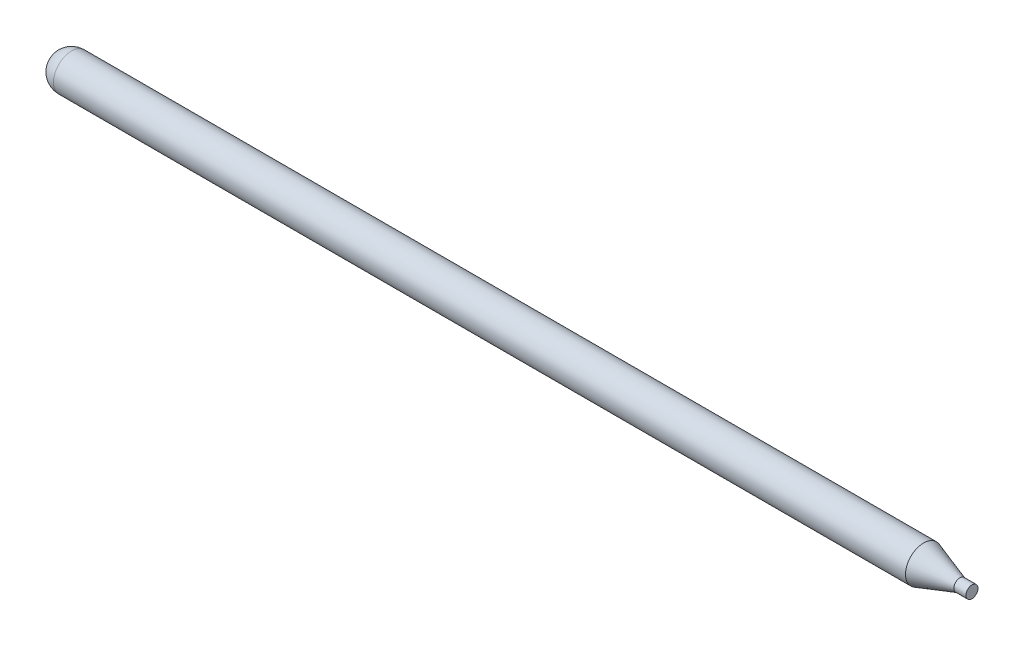
ISO-10303-21;
HEADER;
FILE_DESCRIPTION(('STEP AP214'),'2;1');
FILE_NAME('part.step','',(''),(''),'','','');
FILE_SCHEMA(('AUTOMOTIVE_DESIGN { 1 0 10303 214 1 1 1 1 }'));
ENDSEC;
DATA;
#1=APPLICATION_CONTEXT('core data for automotive mechanical design processes');
#2=APPLICATION_PROTOCOL_DEFINITION('international standard','automotive_design',2000,#1);
#3=PRODUCT_CONTEXT('',#1,'mechanical');
#4=PRODUCT('Part','Part','',(#3));
#5=PRODUCT_RELATED_PRODUCT_CATEGORY('part','',(#4));
#6=PRODUCT_DEFINITION_FORMATION('','',#4);
#7=PRODUCT_DEFINITION_CONTEXT('part definition',#1,'design');
#8=PRODUCT_DEFINITION('design','',#6,#7);
#9=PRODUCT_DEFINITION_SHAPE('','',#8);
#10=(LENGTH_UNIT() NAMED_UNIT(*) SI_UNIT(.MILLI.,.METRE.));
#11=(NAMED_UNIT(*) PLANE_ANGLE_UNIT() SI_UNIT($,.RADIAN.));
#12=(NAMED_UNIT(*) SI_UNIT($,.STERADIAN.) SOLID_ANGLE_UNIT());
#13=UNCERTAINTY_MEASURE_WITH_UNIT(LENGTH_MEASURE(1.E-05),#10,'distance_accuracy_value','');
#14=(GEOMETRIC_REPRESENTATION_CONTEXT(3) GLOBAL_UNCERTAINTY_ASSIGNED_CONTEXT((#13)) GLOBAL_UNIT_ASSIGNED_CONTEXT((#10,
#11,#12)) REPRESENTATION_CONTEXT('',''));
#15=CARTESIAN_POINT('',(0.,0.,0.));
#16=DIRECTION('',(0.,0.,1.));
#17=DIRECTION('',(1.,0.,0.));
#18=AXIS2_PLACEMENT_3D('',#15,#16,#17);
#19=CARTESIAN_POINT('',(-69.,0.,0.));
#20=DIRECTION('',(-1.,0.,0.));
#21=DIRECTION('',(0.,1.,0.));
#22=AXIS2_PLACEMENT_3D('',#19,#20,#21);
#23=SPHERICAL_SURFACE('',#22,3.);
#24=CARTESIAN_POINT('',(-69.,0.,0.));
#25=DIRECTION('',(-1.,0.,0.));
#26=DIRECTION('',(0.,0.,1.));
#27=AXIS2_PLACEMENT_3D('',#24,#25,#26);
#28=CIRCLE('',#27,2.99999999999999);
#29=CARTESIAN_POINT('',(-69.,0.,2.99999999999999));
#30=VERTEX_POINT('',#29);
#31=EDGE_CURVE('E49',#30,#30,#28,.T.);
#32=ORIENTED_EDGE('',*,*,#31,.T.);
#33=EDGE_LOOP('',(#32));
#34=FACE_BOUND('',#33,.T.);
#35=ADVANCED_FACE('F35',(#34),#23,.T.);
#36=CARTESIAN_POINT('',(80.,1.,0.));
#37=DIRECTION('',(-1.,0.,0.));
#38=DIRECTION('',(0.,0.,1.));
#39=AXIS2_PLACEMENT_3D('',#36,#37,#38);
#40=PLANE('',#39);
#41=CARTESIAN_POINT('',(80.,0.,0.));
#42=DIRECTION('',(-1.,0.,0.));
#43=DIRECTION('',(0.,0.,1.));
#44=AXIS2_PLACEMENT_3D('',#41,#42,#43);
#45=CIRCLE('',#44,0.999999999999987);
#46=CARTESIAN_POINT('',(80.,0.,0.999999999999987));
#47=VERTEX_POINT('',#46);
#48=EDGE_CURVE('E10',#47,#47,#45,.T.);
#49=ORIENTED_EDGE('',*,*,#48,.F.);
#50=EDGE_LOOP('',(#49));
#51=FACE_BOUND('',#50,.T.);
#52=ADVANCED_FACE('F69',(#51),#40,.F.);
#53=CARTESIAN_POINT('',(-72.,0.,0.));
#54=DIRECTION('',(-1.,0.,0.));
#55=DIRECTION('',(0.,0.,1.));
#56=AXIS2_PLACEMENT_3D('',#53,#54,#55);
#57=CYLINDRICAL_SURFACE('',#56,0.999999999999987);
#58=CARTESIAN_POINT('',(78.,0.,0.));
#59=DIRECTION('',(-1.,0.,0.));
#60=DIRECTION('',(0.,0.,1.));
#61=AXIS2_PLACEMENT_3D('',#58,#59,#60);
#62=CIRCLE('',#61,0.999999999999987);
#63=CARTESIAN_POINT('',(78.,0.,0.999999999999984));
#64=VERTEX_POINT('',#63);
#65=EDGE_CURVE('E41',#64,#64,#62,.T.);
#66=ORIENTED_EDGE('',*,*,#65,.F.);
#67=EDGE_LOOP('',(#66));
#68=FACE_BOUND('',#67,.T.);
#69=ORIENTED_EDGE('',*,*,#48,.T.);
#70=EDGE_LOOP('',(#69));
#71=FACE_BOUND('',#70,.T.);
#72=ADVANCED_FACE('F64',(#68,#71),#57,.T.);
#73=CARTESIAN_POINT('',(78.,0.,0.));
#74=DIRECTION('',(-1.,0.,0.));
#75=DIRECTION('',(0.,0.,1.));
#76=AXIS2_PLACEMENT_3D('',#73,#74,#75);
#77=CONICAL_SURFACE('',#76,0.999999999999987,0.321750554396642);
#78=CARTESIAN_POINT('',(72.,0.,0.));
#79=DIRECTION('',(-1.,0.,0.));
#80=DIRECTION('',(0.,0.,1.));
#81=AXIS2_PLACEMENT_3D('',#78,#79,#80);
#82=CIRCLE('',#81,2.99999999999999);
#83=CARTESIAN_POINT('',(72.,0.,2.99999999999998));
#84=VERTEX_POINT('',#83);
#85=EDGE_CURVE('E45',#84,#84,#82,.T.);
#86=CARTESIAN_POINT('',(72.,0.,2.99999999999998));
#87=CARTESIAN_POINT('',(72.0625,0.,2.97916666666665));
#88=CARTESIAN_POINT('',(72.125,0.,2.95833333333332));
#89=CARTESIAN_POINT('',(72.25,0.,2.91666666666665));
#90=CARTESIAN_POINT('',(72.3125,0.,2.89583333333332));
#91=CARTESIAN_POINT('',(72.4375,0.,2.85416666666665));
#92=CARTESIAN_POINT('',(72.5,0.,2.83333333333332));
#93=CARTESIAN_POINT('',(72.625,0.,2.79166666666665));
#94=CARTESIAN_POINT('',(72.6875,0.,2.77083333333332));
#95=CARTESIAN_POINT('',(72.8125,0.,2.72916666666665));
#96=CARTESIAN_POINT('',(72.875,0.,2.70833333333332));
#97=CARTESIAN_POINT('',(73.,0.,2.66666666666665));
#98=CARTESIAN_POINT('',(73.0625,0.,2.64583333333332));
#99=CARTESIAN_POINT('',(73.1875,0.,2.60416666666665));
#100=CARTESIAN_POINT('',(73.25,0.,2.58333333333332));
#101=CARTESIAN_POINT('',(73.375,0.,2.54166666666665));
#102=CARTESIAN_POINT('',(73.4375,0.,2.52083333333332));
#103=CARTESIAN_POINT('',(73.5625,0.,2.47916666666665));
#104=CARTESIAN_POINT('',(73.625,0.,2.45833333333332));
#105=CARTESIAN_POINT('',(73.75,0.,2.41666666666665));
#106=CARTESIAN_POINT('',(73.8125,0.,2.39583333333332));
#107=CARTESIAN_POINT('',(73.9375,0.,2.35416666666665));
#108=CARTESIAN_POINT('',(74.,0.,2.33333333333332));
#109=CARTESIAN_POINT('',(74.125,0.,2.29166666666665));
#110=CARTESIAN_POINT('',(74.1875,0.,2.27083333333332));
#111=CARTESIAN_POINT('',(74.3125,0.,2.22916666666665));
#112=CARTESIAN_POINT('',(74.375,0.,2.20833333333332));
#113=CARTESIAN_POINT('',(74.5,0.,2.16666666666665));
#114=CARTESIAN_POINT('',(74.5625,0.,2.14583333333332));
#115=CARTESIAN_POINT('',(74.6875,0.,2.10416666666665));
#116=CARTESIAN_POINT('',(74.75,0.,2.08333333333332));
#117=CARTESIAN_POINT('',(74.875,0.,2.04166666666665));
#118=CARTESIAN_POINT('',(74.9375,0.,2.02083333333332));
#119=CARTESIAN_POINT('',(75.0625,0.,1.97916666666665));
#120=CARTESIAN_POINT('',(75.125,0.,1.95833333333332));
#121=CARTESIAN_POINT('',(75.25,0.,1.91666666666665));
#122=CARTESIAN_POINT('',(75.3125,0.,1.89583333333332));
#123=CARTESIAN_POINT('',(75.4375,0.,1.85416666666665));
#124=CARTESIAN_POINT('',(75.5,0.,1.83333333333332));
#125=CARTESIAN_POINT('',(75.625,0.,1.79166666666665));
#126=CARTESIAN_POINT('',(75.6875,0.,1.77083333333332));
#127=CARTESIAN_POINT('',(75.8125,0.,1.72916666666665));
#128=CARTESIAN_POINT('',(75.875,0.,1.70833333333332));
#129=CARTESIAN_POINT('',(76.,0.,1.66666666666665));
#130=CARTESIAN_POINT('',(76.0625,0.,1.64583333333332));
#131=CARTESIAN_POINT('',(76.1875,0.,1.60416666666665));
#132=CARTESIAN_POINT('',(76.25,0.,1.58333333333332));
#133=CARTESIAN_POINT('',(76.375,0.,1.54166666666665));
#134=CARTESIAN_POINT('',(76.4375,0.,1.52083333333332));
#135=CARTESIAN_POINT('',(76.5625,0.,1.47916666666665));
#136=CARTESIAN_POINT('',(76.625,0.,1.45833333333332));
#137=CARTESIAN_POINT('',(76.75,0.,1.41666666666665));
#138=CARTESIAN_POINT('',(76.8125,0.,1.39583333333332));
#139=CARTESIAN_POINT('',(76.9375,0.,1.35416666666665));
#140=CARTESIAN_POINT('',(77.,0.,1.33333333333332));
#141=CARTESIAN_POINT('',(77.125,0.,1.29166666666665));
#142=CARTESIAN_POINT('',(77.1875,0.,1.27083333333332));
#143=CARTESIAN_POINT('',(77.3125,0.,1.22916666666665));
#144=CARTESIAN_POINT('',(77.375,0.,1.20833333333332));
#145=CARTESIAN_POINT('',(77.5,0.,1.16666666666665));
#146=CARTESIAN_POINT('',(77.5625,0.,1.14583333333332));
#147=CARTESIAN_POINT('',(77.6875,0.,1.10416666666665));
#148=CARTESIAN_POINT('',(77.75,0.,1.08333333333332));
#149=CARTESIAN_POINT('',(77.875,0.,1.04166666666665));
#150=CARTESIAN_POINT('',(77.9375,0.,1.02083333333332));
#151=CARTESIAN_POINT('',(78.,0.,0.999999999999984));
#152=B_SPLINE_CURVE_WITH_KNOTS('',3,(#86,#87,#88,#89,#90,#91,#92,#93,#94,#95,#96,#97,#98,#99,
#100,#101,#102,#103,#104,#105,#106,#107,#108,#109,#110,#111,#112,#113,#114,#115,#116,#117,#118,
#119,#120,#121,#122,#123,#124,#125,#126,#127,#128,#129,#130,#131,#132,#133,#134,#135,#136,#137,
#138,#139,#140,#141,#142,#143,#144,#145,#146,#147,#148,#149,#150,#151),.UNSPECIFIED.,.F.,.F.,(4,
2,2,2,2,2,2,2,2,2,2,2,2,2,2,2,2,2,2,2,2,2,2,2,2,2,2,2,2,2,2,2,4),(0.,0.197642353760517,
0.395284707521035,0.592927061281565,0.790569415042096,0.988211768802613,1.18585412256313,
1.38349647632366,1.58113883008419,1.77878118384471,1.97642353760523,2.17406589136576,
2.37170824512629,2.5693505988868,2.76699295264732,2.96463530640785,3.16227766016838,
3.3599200139289,3.55756236768942,3.75520472144995,3.95284707521048,4.15048942897099,
4.34813178273151,4.54577413649204,4.74341649025257,4.94105884401309,5.13870119777361,
5.33634355153414,5.53398590529467,5.73162825905519,5.9292706128157,6.12691296657623,
6.32455532033677),.UNSPECIFIED.);
#153=EDGE_CURVE('BSEAM59',#84,#64,#152,.T.);
#154=ORIENTED_EDGE('',*,*,#85,.F.);
#155=ORIENTED_EDGE('',*,*,#65,.T.);
#156=ORIENTED_EDGE('',*,*,#153,.T.);
#157=ORIENTED_EDGE('',*,*,#153,.F.);
#158=EDGE_LOOP('',(#154,#156,#155,#157));
#159=FACE_BOUND('',#158,.T.);
#160=ADVANCED_FACE('F59',(#159),#77,.T.);
#161=CARTESIAN_POINT('',(-72.,0.,0.));
#162=DIRECTION('',(-1.,0.,0.));
#163=DIRECTION('',(0.,0.,1.));
#164=AXIS2_PLACEMENT_3D('',#161,#162,#163);
#165=CYLINDRICAL_SURFACE('',#164,2.99999999999999);
#166=ORIENTED_EDGE('',*,*,#31,.F.);
#167=EDGE_LOOP('',(#166));
#168=FACE_BOUND('',#167,.T.);
#169=ORIENTED_EDGE('',*,*,#85,.T.);
#170=EDGE_LOOP('',(#169));
#171=FACE_BOUND('',#170,.T.);
#172=ADVANCED_FACE('F56',(#168,#171),#165,.T.);
#173=CLOSED_SHELL('',(#35,#52,#72,#160,#172));
#174=MANIFOLD_SOLID_BREP('B2',#173);
#175=ADVANCED_BREP_SHAPE_REPRESENTATION('',(#18,#174),#14);
#176=SHAPE_DEFINITION_REPRESENTATION(#9,#175);
ENDSEC;
END-ISO-10303-21;
